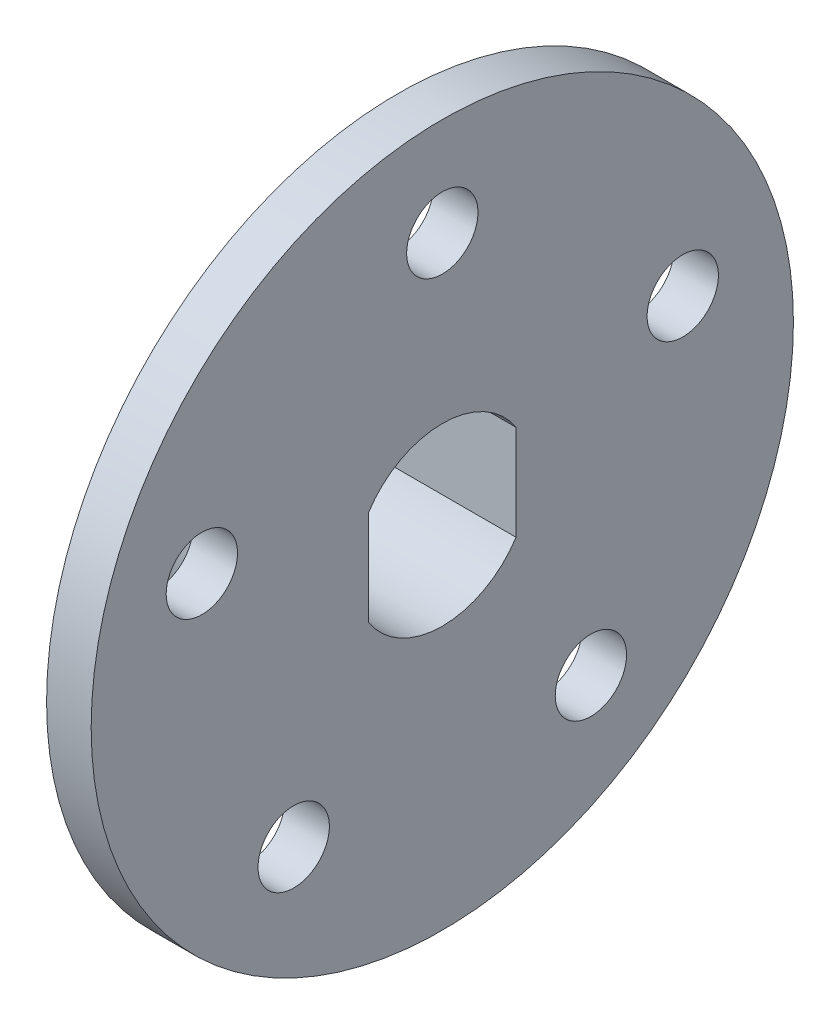
ISO-10303-21;
HEADER;
FILE_DESCRIPTION(('STEP AP214'),'2;1');
FILE_NAME('part.step','',(''),(''),'','','');
FILE_SCHEMA(('AUTOMOTIVE_DESIGN { 1 0 10303 214 1 1 1 1 }'));
ENDSEC;
DATA;
#1=APPLICATION_CONTEXT('core data for automotive mechanical design processes');
#2=APPLICATION_PROTOCOL_DEFINITION('international standard','automotive_design',2000,#1);
#3=PRODUCT_CONTEXT('',#1,'mechanical');
#4=PRODUCT('Part','Part','',(#3));
#5=PRODUCT_RELATED_PRODUCT_CATEGORY('part','',(#4));
#6=PRODUCT_DEFINITION_FORMATION('','',#4);
#7=PRODUCT_DEFINITION_CONTEXT('part definition',#1,'design');
#8=PRODUCT_DEFINITION('design','',#6,#7);
#9=PRODUCT_DEFINITION_SHAPE('','',#8);
#10=(LENGTH_UNIT() NAMED_UNIT(*) SI_UNIT(.MILLI.,.METRE.));
#11=(NAMED_UNIT(*) PLANE_ANGLE_UNIT() SI_UNIT($,.RADIAN.));
#12=(NAMED_UNIT(*) SI_UNIT($,.STERADIAN.) SOLID_ANGLE_UNIT());
#13=UNCERTAINTY_MEASURE_WITH_UNIT(LENGTH_MEASURE(1.E-05),#10,'distance_accuracy_value','');
#14=(GEOMETRIC_REPRESENTATION_CONTEXT(3) GLOBAL_UNCERTAINTY_ASSIGNED_CONTEXT((#13)) GLOBAL_UNIT_ASSIGNED_CONTEXT((#10,
#11,#12)) REPRESENTATION_CONTEXT('',''));
#15=CARTESIAN_POINT('',(0.,0.,0.));
#16=DIRECTION('',(0.,0.,1.));
#17=DIRECTION('',(1.,0.,0.));
#18=AXIS2_PLACEMENT_3D('',#15,#16,#17);
#19=CARTESIAN_POINT('',(0.,0.,0.));
#20=DIRECTION('',(1.,0.,0.));
#21=DIRECTION('',(0.,0.,-1.));
#22=AXIS2_PLACEMENT_3D('',#19,#20,#21);
#23=PLANE('',#22);
#24=CARTESIAN_POINT('',(0.,0.,0.));
#25=DIRECTION('',(1.,0.,0.));
#26=DIRECTION('',(0.,0.,-1.));
#27=AXIS2_PLACEMENT_3D('',#24,#25,#26);
#28=CIRCLE('',#27,11.);
#29=CARTESIAN_POINT('',(0.,0.,-11.));
#30=VERTEX_POINT('',#29);
#31=EDGE_CURVE('E42',#30,#30,#28,.T.);
#32=ORIENTED_EDGE('',*,*,#31,.F.);
#33=EDGE_LOOP('',(#32));
#34=FACE_BOUND('',#33,.T.);
#35=CARTESIAN_POINT('',(0.,0.,0.));
#36=DIRECTION('',(1.,0.,0.));
#37=DIRECTION('',(0.,0.,-1.));
#38=AXIS2_PLACEMENT_3D('',#35,#36,#37);
#39=CIRCLE('',#38,6.25);
#40=CARTESIAN_POINT('',(0.,3.39116499156263,-5.25));
#41=VERTEX_POINT('',#40);
#42=CARTESIAN_POINT('',(0.,3.39116499156263,5.25));
#43=VERTEX_POINT('',#42);
#44=EDGE_CURVE('E53',#41,#43,#39,.T.);
#45=ORIENTED_EDGE('',*,*,#44,.T.);
#46=DIRECTION('',(0.,-1.,0.));
#47=VECTOR('',#46,1.);
#48=CARTESIAN_POINT('',(0.,3.39116499156263,5.25));
#49=LINE('',#48,#47);
#50=CARTESIAN_POINT('',(0.,-3.39116499156263,5.25));
#51=VERTEX_POINT('',#50);
#52=EDGE_CURVE('E87',#43,#51,#49,.T.);
#53=ORIENTED_EDGE('',*,*,#52,.T.);
#54=CARTESIAN_POINT('',(0.,0.,0.));
#55=DIRECTION('',(1.,0.,0.));
#56=DIRECTION('',(0.,0.,-1.));
#57=AXIS2_PLACEMENT_3D('',#54,#55,#56);
#58=CIRCLE('',#57,6.25);
#59=CARTESIAN_POINT('',(0.,-3.39116499156264,-5.25));
#60=VERTEX_POINT('',#59);
#61=EDGE_CURVE('E115',#51,#60,#58,.T.);
#62=ORIENTED_EDGE('',*,*,#61,.T.);
#63=DIRECTION('',(0.,1.,0.));
#64=VECTOR('',#63,1.);
#65=CARTESIAN_POINT('',(0.,3.39116499156263,-5.25));
#66=LINE('',#65,#64);
#67=EDGE_CURVE('E118',#60,#41,#66,.T.);
#68=ORIENTED_EDGE('',*,*,#67,.T.);
#69=EDGE_LOOP('',(#45,#53,#62,#68));
#70=FACE_BOUND('',#69,.T.);
#71=ADVANCED_FACE('F38',(#34,#70),#23,.F.);
#72=CARTESIAN_POINT('',(5.925,0.,0.));
#73=DIRECTION('',(-1.,0.,0.));
#74=DIRECTION('',(0.,0.,1.));
#75=AXIS2_PLACEMENT_3D('',#72,#73,#74);
#76=CYLINDRICAL_SURFACE('',#75,11.);
#77=CARTESIAN_POINT('',(5.925,0.,0.));
#78=DIRECTION('',(1.,0.,0.));
#79=DIRECTION('',(0.,0.,-1.));
#80=AXIS2_PLACEMENT_3D('',#77,#78,#79);
#81=CIRCLE('',#80,11.);
#82=CARTESIAN_POINT('',(5.925,0.,-11.));
#83=VERTEX_POINT('',#82);
#84=EDGE_CURVE('E11',#83,#83,#81,.T.);
#85=ORIENTED_EDGE('',*,*,#84,.F.);
#86=EDGE_LOOP('',(#85));
#87=FACE_BOUND('',#86,.T.);
#88=ORIENTED_EDGE('',*,*,#31,.T.);
#89=EDGE_LOOP('',(#88));
#90=FACE_BOUND('',#89,.T.);
#91=ADVANCED_FACE('F40',(#87,#90),#76,.T.);
#92=CARTESIAN_POINT('',(5.925,0.,0.));
#93=DIRECTION('',(-1.,0.,0.));
#94=DIRECTION('',(0.,0.,1.));
#95=AXIS2_PLACEMENT_3D('',#92,#93,#94);
#96=CYLINDRICAL_SURFACE('',#95,6.25);
#97=ORIENTED_EDGE('',*,*,#44,.F.);
#98=DIRECTION('',(-1.,0.,0.));
#99=VECTOR('',#98,1.);
#100=CARTESIAN_POINT('',(5.925,3.39116499156263,-5.25));
#101=LINE('',#100,#99);
#102=CARTESIAN_POINT('',(9.1,3.39116499156263,-5.25));
#103=VERTEX_POINT('',#102);
#104=EDGE_CURVE('E93',#103,#41,#101,.T.);
#105=ORIENTED_EDGE('',*,*,#104,.F.);
#106=CARTESIAN_POINT('',(9.1,0.,0.));
#107=DIRECTION('',(1.,0.,0.));
#108=DIRECTION('',(0.,0.,-1.));
#109=AXIS2_PLACEMENT_3D('',#106,#107,#108);
#110=CIRCLE('',#109,6.25);
#111=CARTESIAN_POINT('',(9.1,3.39116499156263,5.25));
#112=VERTEX_POINT('',#111);
#113=EDGE_CURVE('E91',#103,#112,#110,.T.);
#114=ORIENTED_EDGE('',*,*,#113,.T.);
#115=DIRECTION('',(-1.,0.,0.));
#116=VECTOR('',#115,1.);
#117=CARTESIAN_POINT('',(5.925,3.39116499156263,5.25));
#118=LINE('',#117,#116);
#119=EDGE_CURVE('E80',#112,#43,#118,.T.);
#120=ORIENTED_EDGE('',*,*,#119,.T.);
#121=EDGE_LOOP('',(#97,#105,#114,#120));
#122=FACE_BOUND('',#121,.T.);
#123=ADVANCED_FACE('F92',(#122),#96,.F.);
#124=CARTESIAN_POINT('',(5.925,3.39116499156263,5.25));
#125=DIRECTION('',(0.,0.,-1.));
#126=DIRECTION('',(-1.,0.,0.));
#127=AXIS2_PLACEMENT_3D('',#124,#125,#126);
#128=PLANE('',#127);
#129=ORIENTED_EDGE('',*,*,#52,.F.);
#130=ORIENTED_EDGE('',*,*,#119,.F.);
#131=DIRECTION('',(0.,-1.,0.));
#132=VECTOR('',#131,1.);
#133=CARTESIAN_POINT('',(9.1,3.39116499156263,5.25));
#134=LINE('',#133,#132);
#135=CARTESIAN_POINT('',(9.1,-3.39116499156263,5.25));
#136=VERTEX_POINT('',#135);
#137=EDGE_CURVE('E84',#112,#136,#134,.T.);
#138=ORIENTED_EDGE('',*,*,#137,.T.);
#139=DIRECTION('',(-1.,0.,0.));
#140=VECTOR('',#139,1.);
#141=CARTESIAN_POINT('',(5.925,-3.39116499156263,5.25));
#142=LINE('',#141,#140);
#143=EDGE_CURVE('E88',#136,#51,#142,.T.);
#144=ORIENTED_EDGE('',*,*,#143,.T.);
#145=EDGE_LOOP('',(#129,#130,#138,#144));
#146=FACE_BOUND('',#145,.T.);
#147=ADVANCED_FACE('F82',(#146),#128,.T.);
#148=CARTESIAN_POINT('',(5.925,0.,0.));
#149=DIRECTION('',(-1.,0.,0.));
#150=DIRECTION('',(0.,0.,1.));
#151=AXIS2_PLACEMENT_3D('',#148,#149,#150);
#152=CYLINDRICAL_SURFACE('',#151,6.25);
#153=ORIENTED_EDGE('',*,*,#61,.F.);
#154=ORIENTED_EDGE('',*,*,#143,.F.);
#155=CARTESIAN_POINT('',(9.1,0.,0.));
#156=DIRECTION('',(1.,0.,0.));
#157=DIRECTION('',(0.,0.,-1.));
#158=AXIS2_PLACEMENT_3D('',#155,#156,#157);
#159=CIRCLE('',#158,6.25);
#160=CARTESIAN_POINT('',(9.1,-3.39116499156264,-5.25));
#161=VERTEX_POINT('',#160);
#162=EDGE_CURVE('E100',#136,#161,#159,.T.);
#163=ORIENTED_EDGE('',*,*,#162,.T.);
#164=DIRECTION('',(-1.,0.,0.));
#165=VECTOR('',#164,1.);
#166=CARTESIAN_POINT('',(5.925,-3.39116499156264,-5.25));
#167=LINE('',#166,#165);
#168=EDGE_CURVE('E61',#161,#60,#167,.T.);
#169=ORIENTED_EDGE('',*,*,#168,.T.);
#170=EDGE_LOOP('',(#153,#154,#163,#169));
#171=FACE_BOUND('',#170,.T.);
#172=ADVANCED_FACE('F123',(#171),#152,.F.);
#173=CARTESIAN_POINT('',(5.925,3.39116499156263,-5.25));
#174=DIRECTION('',(0.,0.,1.));
#175=DIRECTION('',(1.,0.,0.));
#176=AXIS2_PLACEMENT_3D('',#173,#174,#175);
#177=PLANE('',#176);
#178=ORIENTED_EDGE('',*,*,#67,.F.);
#179=ORIENTED_EDGE('',*,*,#168,.F.);
#180=DIRECTION('',(0.,1.,0.));
#181=VECTOR('',#180,1.);
#182=CARTESIAN_POINT('',(9.1,-3.39116499156264,-5.25));
#183=LINE('',#182,#181);
#184=EDGE_CURVE('E102',#161,#103,#183,.T.);
#185=ORIENTED_EDGE('',*,*,#184,.T.);
#186=ORIENTED_EDGE('',*,*,#104,.T.);
#187=EDGE_LOOP('',(#178,#179,#185,#186));
#188=FACE_BOUND('',#187,.T.);
#189=ADVANCED_FACE('F126',(#188),#177,.T.);
#190=CARTESIAN_POINT('',(9.1,0.,0.));
#191=DIRECTION('',(1.,0.,0.));
#192=DIRECTION('',(0.,0.,-1.));
#193=AXIS2_PLACEMENT_3D('',#190,#191,#192);
#194=PLANE('',#193);
#195=CARTESIAN_POINT('',(9.1,18.,0.));
#196=DIRECTION('',(-1.,0.,0.));
#197=DIRECTION('',(0.,0.,1.));
#198=AXIS2_PLACEMENT_3D('',#195,#196,#197);
#199=CIRCLE('',#198,2.54);
#200=CARTESIAN_POINT('',(9.1,18.,2.54));
#201=VERTEX_POINT('',#200);
#202=EDGE_CURVE('E97',#201,#201,#199,.T.);
#203=ORIENTED_EDGE('',*,*,#202,.T.);
#204=EDGE_LOOP('',(#203));
#205=FACE_BOUND('',#204,.T.);
#206=CARTESIAN_POINT('',(9.1,5.56230589874906,17.1190172933128));
#207=DIRECTION('',(-1.,0.,0.));
#208=DIRECTION('',(0.,0.,1.));
#209=AXIS2_PLACEMENT_3D('',#206,#207,#208);
#210=CIRCLE('',#209,2.54);
#211=CARTESIAN_POINT('',(9.1,5.56230589874906,19.6590172933128));
#212=VERTEX_POINT('',#211);
#213=EDGE_CURVE('E250',#212,#212,#210,.T.);
#214=ORIENTED_EDGE('',*,*,#213,.T.);
#215=EDGE_LOOP('',(#214));
#216=FACE_BOUND('',#215,.T.);
#217=CARTESIAN_POINT('',(9.1,-14.5623058987491,10.5801345412645));
#218=DIRECTION('',(-1.,0.,0.));
#219=DIRECTION('',(0.,0.,1.));
#220=AXIS2_PLACEMENT_3D('',#217,#218,#219);
#221=CIRCLE('',#220,2.54);
#222=CARTESIAN_POINT('',(9.1,-14.5623058987491,13.1201345412645));
#223=VERTEX_POINT('',#222);
#224=EDGE_CURVE('E259',#223,#223,#221,.T.);
#225=ORIENTED_EDGE('',*,*,#224,.T.);
#226=EDGE_LOOP('',(#225));
#227=FACE_BOUND('',#226,.T.);
#228=CARTESIAN_POINT('',(9.1,-14.5623058987491,-10.5801345412645));
#229=DIRECTION('',(-1.,0.,0.));
#230=DIRECTION('',(0.,0.,1.));
#231=AXIS2_PLACEMENT_3D('',#228,#229,#230);
#232=CIRCLE('',#231,2.54);
#233=CARTESIAN_POINT('',(9.1,-14.5623058987491,-8.04013454126452));
#234=VERTEX_POINT('',#233);
#235=EDGE_CURVE('E265',#234,#234,#232,.T.);
#236=ORIENTED_EDGE('',*,*,#235,.T.);
#237=EDGE_LOOP('',(#236));
#238=FACE_BOUND('',#237,.T.);
#239=CARTESIAN_POINT('',(9.1,5.56230589874905,-17.1190172933128));
#240=DIRECTION('',(-1.,0.,0.));
#241=DIRECTION('',(0.,0.,1.));
#242=AXIS2_PLACEMENT_3D('',#239,#240,#241);
#243=CIRCLE('',#242,2.54);
#244=CARTESIAN_POINT('',(9.1,5.56230589874905,-14.5790172933128));
#245=VERTEX_POINT('',#244);
#246=EDGE_CURVE('E271',#245,#245,#243,.T.);
#247=ORIENTED_EDGE('',*,*,#246,.T.);
#248=EDGE_LOOP('',(#247));
#249=FACE_BOUND('',#248,.T.);
#250=CARTESIAN_POINT('',(9.1,0.,0.));
#251=DIRECTION('',(1.,0.,0.));
#252=DIRECTION('',(0.,0.,-1.));
#253=AXIS2_PLACEMENT_3D('',#250,#251,#252);
#254=CIRCLE('',#253,25.);
#255=CARTESIAN_POINT('',(9.1,0.,-25.));
#256=VERTEX_POINT('',#255);
#257=EDGE_CURVE('E108',#256,#256,#254,.T.);
#258=ORIENTED_EDGE('',*,*,#257,.T.);
#259=EDGE_LOOP('',(#258));
#260=FACE_BOUND('',#259,.T.);
#261=ORIENTED_EDGE('',*,*,#137,.F.);
#262=ORIENTED_EDGE('',*,*,#113,.F.);
#263=ORIENTED_EDGE('',*,*,#184,.F.);
#264=ORIENTED_EDGE('',*,*,#162,.F.);
#265=EDGE_LOOP('',(#261,#262,#263,#264));
#266=FACE_BOUND('',#265,.T.);
#267=ADVANCED_FACE('F99',(#205,#216,#227,#238,#249,#260,#266),#194,.T.);
#268=CARTESIAN_POINT('',(5.925,0.,0.));
#269=DIRECTION('',(1.,0.,0.));
#270=DIRECTION('',(0.,0.,-1.));
#271=AXIS2_PLACEMENT_3D('',#268,#269,#270);
#272=PLANE('',#271);
#273=CARTESIAN_POINT('',(5.925,18.,0.));
#274=DIRECTION('',(-1.,0.,0.));
#275=DIRECTION('',(0.,0.,1.));
#276=AXIS2_PLACEMENT_3D('',#273,#274,#275);
#277=CIRCLE('',#276,2.54);
#278=CARTESIAN_POINT('',(5.925,18.,2.54));
#279=VERTEX_POINT('',#278);
#280=EDGE_CURVE('E249',#279,#279,#277,.T.);
#281=ORIENTED_EDGE('',*,*,#280,.F.);
#282=EDGE_LOOP('',(#281));
#283=FACE_BOUND('',#282,.T.);
#284=CARTESIAN_POINT('',(5.925,5.56230589874906,17.1190172933128));
#285=DIRECTION('',(-1.,0.,0.));
#286=DIRECTION('',(0.,0.,1.));
#287=AXIS2_PLACEMENT_3D('',#284,#285,#286);
#288=CIRCLE('',#287,2.54);
#289=CARTESIAN_POINT('',(5.925,5.56230589874906,19.6590172933128));
#290=VERTEX_POINT('',#289);
#291=EDGE_CURVE('E254',#290,#290,#288,.T.);
#292=ORIENTED_EDGE('',*,*,#291,.F.);
#293=EDGE_LOOP('',(#292));
#294=FACE_BOUND('',#293,.T.);
#295=CARTESIAN_POINT('',(5.925,-14.5623058987491,10.5801345412645));
#296=DIRECTION('',(-1.,0.,0.));
#297=DIRECTION('',(0.,0.,1.));
#298=AXIS2_PLACEMENT_3D('',#295,#296,#297);
#299=CIRCLE('',#298,2.54);
#300=CARTESIAN_POINT('',(5.925,-14.5623058987491,13.1201345412645));
#301=VERTEX_POINT('',#300);
#302=EDGE_CURVE('E262',#301,#301,#299,.T.);
#303=ORIENTED_EDGE('',*,*,#302,.F.);
#304=EDGE_LOOP('',(#303));
#305=FACE_BOUND('',#304,.T.);
#306=CARTESIAN_POINT('',(5.925,-14.5623058987491,-10.5801345412645));
#307=DIRECTION('',(-1.,0.,0.));
#308=DIRECTION('',(0.,0.,1.));
#309=AXIS2_PLACEMENT_3D('',#306,#307,#308);
#310=CIRCLE('',#309,2.54);
#311=CARTESIAN_POINT('',(5.925,-14.5623058987491,-8.04013454126452));
#312=VERTEX_POINT('',#311);
#313=EDGE_CURVE('E268',#312,#312,#310,.T.);
#314=ORIENTED_EDGE('',*,*,#313,.F.);
#315=EDGE_LOOP('',(#314));
#316=FACE_BOUND('',#315,.T.);
#317=CARTESIAN_POINT('',(5.925,5.56230589874905,-17.1190172933128));
#318=DIRECTION('',(-1.,0.,0.));
#319=DIRECTION('',(0.,0.,1.));
#320=AXIS2_PLACEMENT_3D('',#317,#318,#319);
#321=CIRCLE('',#320,2.54);
#322=CARTESIAN_POINT('',(5.925,5.56230589874905,-14.5790172933128));
#323=VERTEX_POINT('',#322);
#324=EDGE_CURVE('E273',#323,#323,#321,.T.);
#325=ORIENTED_EDGE('',*,*,#324,.F.);
#326=EDGE_LOOP('',(#325));
#327=FACE_BOUND('',#326,.T.);
#328=ORIENTED_EDGE('',*,*,#84,.T.);
#329=EDGE_LOOP('',(#328));
#330=FACE_BOUND('',#329,.T.);
#331=CARTESIAN_POINT('',(5.925,0.,0.));
#332=DIRECTION('',(1.,0.,0.));
#333=DIRECTION('',(0.,0.,-1.));
#334=AXIS2_PLACEMENT_3D('',#331,#332,#333);
#335=CIRCLE('',#334,25.);
#336=CARTESIAN_POINT('',(5.925,0.,-25.));
#337=VERTEX_POINT('',#336);
#338=EDGE_CURVE('E107',#337,#337,#335,.T.);
#339=ORIENTED_EDGE('',*,*,#338,.F.);
#340=EDGE_LOOP('',(#339));
#341=FACE_BOUND('',#340,.T.);
#342=ADVANCED_FACE('F133',(#283,#294,#305,#316,#327,#330,#341),#272,.F.);
#343=CARTESIAN_POINT('',(9.1,0.,0.));
#344=DIRECTION('',(-1.,0.,0.));
#345=DIRECTION('',(0.,0.,1.));
#346=AXIS2_PLACEMENT_3D('',#343,#344,#345);
#347=CYLINDRICAL_SURFACE('',#346,25.);
#348=ORIENTED_EDGE('',*,*,#257,.F.);
#349=EDGE_LOOP('',(#348));
#350=FACE_BOUND('',#349,.T.);
#351=ORIENTED_EDGE('',*,*,#338,.T.);
#352=EDGE_LOOP('',(#351));
#353=FACE_BOUND('',#352,.T.);
#354=ADVANCED_FACE('F169',(#350,#353),#347,.T.);
#355=CARTESIAN_POINT('',(9.1,5.56230589874905,-17.1190172933128));
#356=DIRECTION('',(-1.,0.,0.));
#357=DIRECTION('',(0.,0.,1.));
#358=AXIS2_PLACEMENT_3D('',#355,#356,#357);
#359=CYLINDRICAL_SURFACE('',#358,2.54);
#360=ORIENTED_EDGE('',*,*,#246,.F.);
#361=EDGE_LOOP('',(#360));
#362=FACE_BOUND('',#361,.T.);
#363=ORIENTED_EDGE('',*,*,#324,.T.);
#364=EDGE_LOOP('',(#363));
#365=FACE_BOUND('',#364,.T.);
#366=ADVANCED_FACE('F175',(#362,#365),#359,.F.);
#367=CARTESIAN_POINT('',(9.1,-14.5623058987491,-10.5801345412645));
#368=DIRECTION('',(-1.,0.,0.));
#369=DIRECTION('',(0.,0.,1.));
#370=AXIS2_PLACEMENT_3D('',#367,#368,#369);
#371=CYLINDRICAL_SURFACE('',#370,2.54);
#372=ORIENTED_EDGE('',*,*,#235,.F.);
#373=EDGE_LOOP('',(#372));
#374=FACE_BOUND('',#373,.T.);
#375=ORIENTED_EDGE('',*,*,#313,.T.);
#376=EDGE_LOOP('',(#375));
#377=FACE_BOUND('',#376,.T.);
#378=ADVANCED_FACE('F200',(#374,#377),#371,.F.);
#379=CARTESIAN_POINT('',(9.1,-14.5623058987491,10.5801345412645));
#380=DIRECTION('',(-1.,0.,0.));
#381=DIRECTION('',(0.,0.,1.));
#382=AXIS2_PLACEMENT_3D('',#379,#380,#381);
#383=CYLINDRICAL_SURFACE('',#382,2.54);
#384=ORIENTED_EDGE('',*,*,#224,.F.);
#385=EDGE_LOOP('',(#384));
#386=FACE_BOUND('',#385,.T.);
#387=ORIENTED_EDGE('',*,*,#302,.T.);
#388=EDGE_LOOP('',(#387));
#389=FACE_BOUND('',#388,.T.);
#390=ADVANCED_FACE('F210',(#386,#389),#383,.F.);
#391=CARTESIAN_POINT('',(9.1,5.56230589874906,17.1190172933128));
#392=DIRECTION('',(-1.,0.,0.));
#393=DIRECTION('',(0.,0.,1.));
#394=AXIS2_PLACEMENT_3D('',#391,#392,#393);
#395=CYLINDRICAL_SURFACE('',#394,2.54);
#396=ORIENTED_EDGE('',*,*,#213,.F.);
#397=EDGE_LOOP('',(#396));
#398=FACE_BOUND('',#397,.T.);
#399=ORIENTED_EDGE('',*,*,#291,.T.);
#400=EDGE_LOOP('',(#399));
#401=FACE_BOUND('',#400,.T.);
#402=ADVANCED_FACE('F220',(#398,#401),#395,.F.);
#403=CARTESIAN_POINT('',(9.1,18.,0.));
#404=DIRECTION('',(-1.,0.,0.));
#405=DIRECTION('',(0.,0.,1.));
#406=AXIS2_PLACEMENT_3D('',#403,#404,#405);
#407=CYLINDRICAL_SURFACE('',#406,2.54);
#408=ORIENTED_EDGE('',*,*,#202,.F.);
#409=EDGE_LOOP('',(#408));
#410=FACE_BOUND('',#409,.T.);
#411=ORIENTED_EDGE('',*,*,#280,.T.);
#412=EDGE_LOOP('',(#411));
#413=FACE_BOUND('',#412,.T.);
#414=ADVANCED_FACE('F230',(#410,#413),#407,.F.);
#415=CLOSED_SHELL('',(#71,#91,#123,#147,#172,#189,#267,#342,#354,#366,#378,#390,#402,#414));
#416=MANIFOLD_SOLID_BREP('B2',#415);
#417=ADVANCED_BREP_SHAPE_REPRESENTATION('',(#18,#416),#14);
#418=SHAPE_DEFINITION_REPRESENTATION(#9,#417);
ENDSEC;
END-ISO-10303-21;
